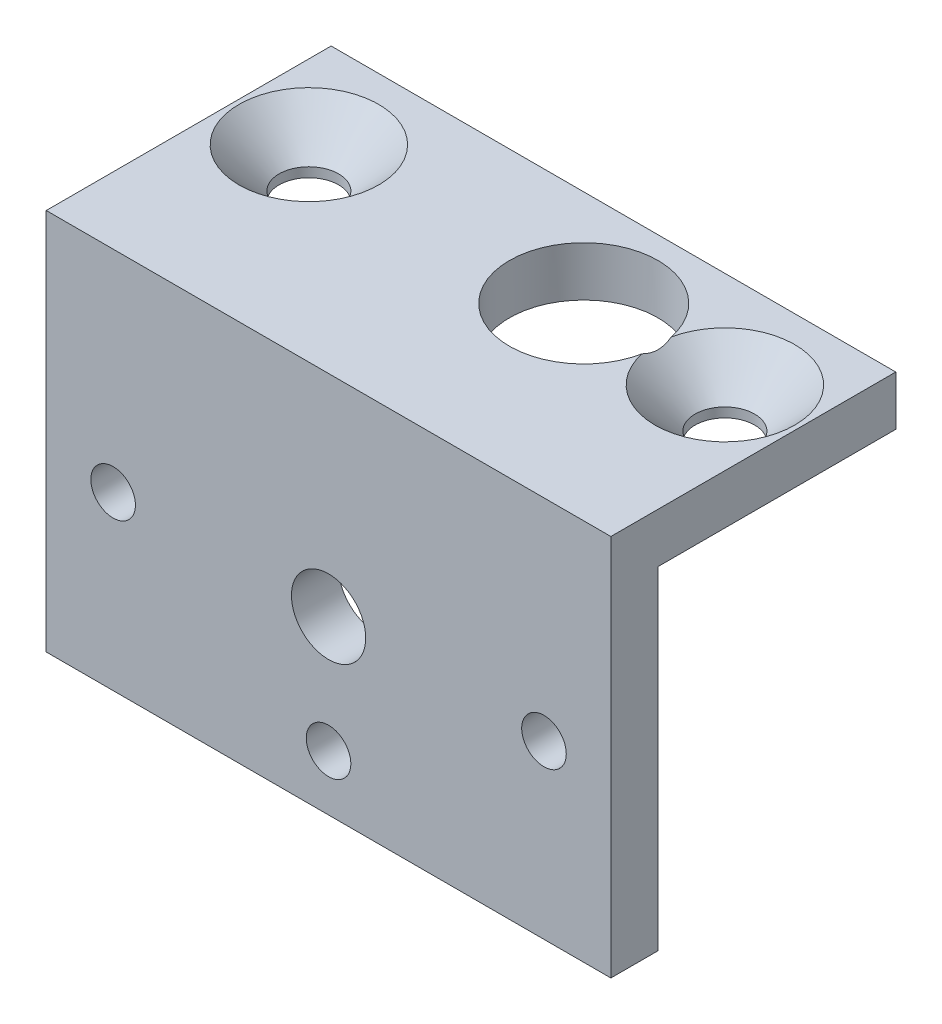
ISO-10303-21;
HEADER;
FILE_DESCRIPTION(('STEP AP214'),'2;1');
FILE_NAME('part.step','',(''),(''),'','','');
FILE_SCHEMA(('AUTOMOTIVE_DESIGN { 1 0 10303 214 1 1 1 1 }'));
ENDSEC;
DATA;
#1=APPLICATION_CONTEXT('core data for automotive mechanical design processes');
#2=APPLICATION_PROTOCOL_DEFINITION('international standard','automotive_design',2000,#1);
#3=PRODUCT_CONTEXT('',#1,'mechanical');
#4=PRODUCT('Part','Part','',(#3));
#5=PRODUCT_RELATED_PRODUCT_CATEGORY('part','',(#4));
#6=PRODUCT_DEFINITION_FORMATION('','',#4);
#7=PRODUCT_DEFINITION_CONTEXT('part definition',#1,'design');
#8=PRODUCT_DEFINITION('design','',#6,#7);
#9=PRODUCT_DEFINITION_SHAPE('','',#8);
#10=(LENGTH_UNIT() NAMED_UNIT(*) SI_UNIT(.MILLI.,.METRE.));
#11=(NAMED_UNIT(*) PLANE_ANGLE_UNIT() SI_UNIT($,.RADIAN.));
#12=(NAMED_UNIT(*) SI_UNIT($,.STERADIAN.) SOLID_ANGLE_UNIT());
#13=UNCERTAINTY_MEASURE_WITH_UNIT(LENGTH_MEASURE(1.E-05),#10,'distance_accuracy_value','');
#14=(GEOMETRIC_REPRESENTATION_CONTEXT(3) GLOBAL_UNCERTAINTY_ASSIGNED_CONTEXT((#13)) GLOBAL_UNIT_ASSIGNED_CONTEXT((#10,
#11,#12)) REPRESENTATION_CONTEXT('',''));
#15=CARTESIAN_POINT('',(0.,0.,0.));
#16=DIRECTION('',(0.,0.,1.));
#17=DIRECTION('',(1.,0.,0.));
#18=AXIS2_PLACEMENT_3D('',#15,#16,#17);
#19=CARTESIAN_POINT('',(19.0017833547208,-12.8676857975596,0.));
#20=DIRECTION('',(0.,0.,1.));
#21=DIRECTION('',(1.,0.,0.));
#22=AXIS2_PLACEMENT_3D('',#19,#20,#21);
#23=PLANE('',#22);
#24=CARTESIAN_POINT('',(0.,-9.13231420244036,0.));
#25=DIRECTION('',(0.,0.,1.));
#26=DIRECTION('',(1.,0.,0.));
#27=AXIS2_PLACEMENT_3D('',#24,#25,#26);
#28=CIRCLE('',#27,1.5);
#29=CARTESIAN_POINT('',(1.5,-9.13231420244036,0.));
#30=VERTEX_POINT('',#29);
#31=EDGE_CURVE('E139',#30,#30,#28,.T.);
#32=ORIENTED_EDGE('',*,*,#31,.T.);
#33=EDGE_LOOP('',(#32));
#34=FACE_BOUND('',#33,.T.);
#35=CARTESIAN_POINT('',(14.5,-1.30731420244036,0.));
#36=DIRECTION('',(0.,0.,1.));
#37=DIRECTION('',(1.,0.,0.));
#38=AXIS2_PLACEMENT_3D('',#35,#36,#37);
#39=CIRCLE('',#38,1.5);
#40=CARTESIAN_POINT('',(16.,-1.30731420244036,0.));
#41=VERTEX_POINT('',#40);
#42=EDGE_CURVE('E153',#41,#41,#39,.T.);
#43=ORIENTED_EDGE('',*,*,#42,.T.);
#44=EDGE_LOOP('',(#43));
#45=FACE_BOUND('',#44,.T.);
#46=CARTESIAN_POINT('',(-14.5,-1.30731420244036,0.));
#47=DIRECTION('',(0.,0.,1.));
#48=DIRECTION('',(1.,0.,0.));
#49=AXIS2_PLACEMENT_3D('',#46,#47,#48);
#50=CIRCLE('',#49,1.5);
#51=CARTESIAN_POINT('',(-13.,-1.30731420244036,0.));
#52=VERTEX_POINT('',#51);
#53=EDGE_CURVE('E159',#52,#52,#50,.T.);
#54=ORIENTED_EDGE('',*,*,#53,.T.);
#55=EDGE_LOOP('',(#54));
#56=FACE_BOUND('',#55,.T.);
#57=CARTESIAN_POINT('',(0.,-1.30731420244036,0.));
#58=DIRECTION('',(0.,0.,1.));
#59=DIRECTION('',(1.,0.,0.));
#60=AXIS2_PLACEMENT_3D('',#57,#58,#59);
#61=CIRCLE('',#60,2.5);
#62=CARTESIAN_POINT('',(2.5,-1.30731420244036,0.));
#63=VERTEX_POINT('',#62);
#64=EDGE_CURVE('E148',#63,#63,#61,.T.);
#65=ORIENTED_EDGE('',*,*,#64,.T.);
#66=EDGE_LOOP('',(#65));
#67=FACE_BOUND('',#66,.T.);
#68=DIRECTION('',(-1.,0.,0.));
#69=VECTOR('',#68,1.);
#70=CARTESIAN_POINT('',(-19.0017833547208,9.525,0.));
#71=LINE('',#70,#69);
#72=CARTESIAN_POINT('',(19.0017833547208,9.525,0.));
#73=VERTEX_POINT('',#72);
#74=CARTESIAN_POINT('',(-19.0017833547208,9.525,0.));
#75=VERTEX_POINT('',#74);
#76=EDGE_CURVE('E58',#73,#75,#71,.T.);
#77=ORIENTED_EDGE('',*,*,#76,.F.);
#78=DIRECTION('',(0.,1.,0.));
#79=VECTOR('',#78,1.);
#80=CARTESIAN_POINT('',(19.0017833547208,12.8676857975596,0.));
#81=LINE('',#80,#79);
#82=CARTESIAN_POINT('',(19.0017833547208,-12.8676857975596,0.));
#83=VERTEX_POINT('',#82);
#84=EDGE_CURVE('E165',#83,#73,#81,.T.);
#85=ORIENTED_EDGE('',*,*,#84,.F.);
#86=DIRECTION('',(1.,0.,0.));
#87=VECTOR('',#86,1.);
#88=CARTESIAN_POINT('',(-19.0017833547208,-12.8676857975596,0.));
#89=LINE('',#88,#87);
#90=CARTESIAN_POINT('',(-19.0017833547208,-12.8676857975596,0.));
#91=VERTEX_POINT('',#90);
#92=EDGE_CURVE('E172',#91,#83,#89,.T.);
#93=ORIENTED_EDGE('',*,*,#92,.F.);
#94=DIRECTION('',(0.,-1.,0.));
#95=VECTOR('',#94,1.);
#96=CARTESIAN_POINT('',(-19.0017833547208,12.8676857975596,0.));
#97=LINE('',#96,#95);
#98=EDGE_CURVE('E130',#75,#91,#97,.T.);
#99=ORIENTED_EDGE('',*,*,#98,.F.);
#100=EDGE_LOOP('',(#77,#85,#93,#99));
#101=FACE_BOUND('',#100,.T.);
#102=ADVANCED_FACE('F32',(#34,#45,#56,#67,#101),#23,.F.);
#103=CARTESIAN_POINT('',(19.0017833547208,-12.8676857975596,3.175));
#104=DIRECTION('',(0.,0.,1.));
#105=DIRECTION('',(1.,0.,0.));
#106=AXIS2_PLACEMENT_3D('',#103,#104,#105);
#107=PLANE('',#106);
#108=CARTESIAN_POINT('',(0.,-1.30731420244036,3.175));
#109=DIRECTION('',(0.,0.,1.));
#110=DIRECTION('',(1.,0.,0.));
#111=AXIS2_PLACEMENT_3D('',#108,#109,#110);
#112=CIRCLE('',#111,2.5);
#113=CARTESIAN_POINT('',(2.5,-1.30731420244036,3.175));
#114=VERTEX_POINT('',#113);
#115=EDGE_CURVE('E150',#114,#114,#112,.T.);
#116=ORIENTED_EDGE('',*,*,#115,.F.);
#117=EDGE_LOOP('',(#116));
#118=FACE_BOUND('',#117,.T.);
#119=CARTESIAN_POINT('',(-14.5,-1.30731420244036,3.175));
#120=DIRECTION('',(0.,0.,1.));
#121=DIRECTION('',(1.,0.,0.));
#122=AXIS2_PLACEMENT_3D('',#119,#120,#121);
#123=CIRCLE('',#122,1.5);
#124=CARTESIAN_POINT('',(-13.,-1.30731420244036,3.175));
#125=VERTEX_POINT('',#124);
#126=EDGE_CURVE('E162',#125,#125,#123,.T.);
#127=ORIENTED_EDGE('',*,*,#126,.F.);
#128=EDGE_LOOP('',(#127));
#129=FACE_BOUND('',#128,.T.);
#130=DIRECTION('',(0.,1.,0.));
#131=VECTOR('',#130,1.);
#132=CARTESIAN_POINT('',(19.0017833547208,12.8676857975596,3.175));
#133=LINE('',#132,#131);
#134=CARTESIAN_POINT('',(19.0017833547208,-12.8676857975596,3.175));
#135=VERTEX_POINT('',#134);
#136=CARTESIAN_POINT('',(19.0017833547208,12.8676857975596,3.175));
#137=VERTEX_POINT('',#136);
#138=EDGE_CURVE('E168',#135,#137,#133,.T.);
#139=ORIENTED_EDGE('',*,*,#138,.T.);
#140=DIRECTION('',(-1.,0.,0.));
#141=VECTOR('',#140,1.);
#142=CARTESIAN_POINT('',(-19.0017833547208,12.8676857975596,3.175));
#143=LINE('',#142,#141);
#144=CARTESIAN_POINT('',(-19.0017833547208,12.8676857975596,3.175));
#145=VERTEX_POINT('',#144);
#146=EDGE_CURVE('E171',#137,#145,#143,.T.);
#147=ORIENTED_EDGE('',*,*,#146,.T.);
#148=DIRECTION('',(0.,-1.,0.));
#149=VECTOR('',#148,1.);
#150=CARTESIAN_POINT('',(-19.0017833547208,12.8676857975596,3.175));
#151=LINE('',#150,#149);
#152=CARTESIAN_POINT('',(-19.0017833547208,-12.8676857975596,3.175));
#153=VERTEX_POINT('',#152);
#154=EDGE_CURVE('E174',#145,#153,#151,.T.);
#155=ORIENTED_EDGE('',*,*,#154,.T.);
#156=DIRECTION('',(1.,0.,0.));
#157=VECTOR('',#156,1.);
#158=CARTESIAN_POINT('',(-19.0017833547208,-12.8676857975596,3.175));
#159=LINE('',#158,#157);
#160=EDGE_CURVE('E176',#153,#135,#159,.T.);
#161=ORIENTED_EDGE('',*,*,#160,.T.);
#162=EDGE_LOOP('',(#139,#147,#155,#161));
#163=FACE_BOUND('',#162,.T.);
#164=CARTESIAN_POINT('',(14.5,-1.30731420244036,3.175));
#165=DIRECTION('',(0.,0.,1.));
#166=DIRECTION('',(1.,0.,0.));
#167=AXIS2_PLACEMENT_3D('',#164,#165,#166);
#168=CIRCLE('',#167,1.5);
#169=CARTESIAN_POINT('',(16.,-1.30731420244036,3.175));
#170=VERTEX_POINT('',#169);
#171=EDGE_CURVE('E156',#170,#170,#168,.T.);
#172=ORIENTED_EDGE('',*,*,#171,.F.);
#173=EDGE_LOOP('',(#172));
#174=FACE_BOUND('',#173,.T.);
#175=CARTESIAN_POINT('',(0.,-9.13231420244036,3.175));
#176=DIRECTION('',(0.,0.,1.));
#177=DIRECTION('',(1.,0.,0.));
#178=AXIS2_PLACEMENT_3D('',#175,#176,#177);
#179=CIRCLE('',#178,1.5);
#180=CARTESIAN_POINT('',(1.5,-9.13231420244036,3.175));
#181=VERTEX_POINT('',#180);
#182=EDGE_CURVE('E126',#181,#181,#179,.T.);
#183=ORIENTED_EDGE('',*,*,#182,.F.);
#184=EDGE_LOOP('',(#183));
#185=FACE_BOUND('',#184,.T.);
#186=ADVANCED_FACE('F206',(#118,#129,#163,#174,#185),#107,.T.);
#187=CARTESIAN_POINT('',(19.0017833547208,12.8676857975596,3.175));
#188=DIRECTION('',(-1.,0.,0.));
#189=DIRECTION('',(0.,0.,1.));
#190=AXIS2_PLACEMENT_3D('',#187,#188,#189);
#191=PLANE('',#190);
#192=ORIENTED_EDGE('',*,*,#84,.T.);
#193=DIRECTION('',(0.,0.,1.));
#194=VECTOR('',#193,1.);
#195=CARTESIAN_POINT('',(19.0017833547208,9.525,-16.));
#196=LINE('',#195,#194);
#197=CARTESIAN_POINT('',(19.0017833547208,9.525,-16.));
#198=VERTEX_POINT('',#197);
#199=EDGE_CURVE('E135',#198,#73,#196,.T.);
#200=ORIENTED_EDGE('',*,*,#199,.F.);
#201=DIRECTION('',(0.,-1.,0.));
#202=VECTOR('',#201,1.);
#203=CARTESIAN_POINT('',(19.0017833547208,12.8676857975596,-16.));
#204=LINE('',#203,#202);
#205=CARTESIAN_POINT('',(19.0017833547208,12.8676857975596,-16.));
#206=VERTEX_POINT('',#205);
#207=EDGE_CURVE('E119',#206,#198,#204,.T.);
#208=ORIENTED_EDGE('',*,*,#207,.F.);
#209=DIRECTION('',(0.,0.,-1.));
#210=VECTOR('',#209,1.);
#211=CARTESIAN_POINT('',(19.0017833547208,12.8676857975596,3.175));
#212=LINE('',#211,#210);
#213=EDGE_CURVE('E45',#137,#206,#212,.T.);
#214=ORIENTED_EDGE('',*,*,#213,.F.);
#215=ORIENTED_EDGE('',*,*,#138,.F.);
#216=DIRECTION('',(0.,0.,-1.));
#217=VECTOR('',#216,1.);
#218=CARTESIAN_POINT('',(19.0017833547208,-12.8676857975596,3.175));
#219=LINE('',#218,#217);
#220=EDGE_CURVE('E178',#135,#83,#219,.T.);
#221=ORIENTED_EDGE('',*,*,#220,.T.);
#222=EDGE_LOOP('',(#192,#200,#208,#214,#215,#221));
#223=FACE_BOUND('',#222,.T.);
#224=ADVANCED_FACE('F34',(#223),#191,.F.);
#225=CARTESIAN_POINT('',(-19.0017833547208,12.8676857975596,3.175));
#226=DIRECTION('',(0.,-1.,0.));
#227=DIRECTION('',(0.,0.,-1.));
#228=AXIS2_PLACEMENT_3D('',#225,#226,#227);
#229=PLANE('',#228);
#230=CARTESIAN_POINT('',(-14.,12.8676857975596,-9.5));
#231=DIRECTION('',(0.,1.,0.));
#232=DIRECTION('',(0.,0.,1.));
#233=AXIS2_PLACEMENT_3D('',#230,#231,#232);
#234=CIRCLE('',#233,4.7);
#235=CARTESIAN_POINT('',(-14.,12.8676857975596,-4.8));
#236=VERTEX_POINT('',#235);
#237=EDGE_CURVE('E248',#236,#236,#234,.T.);
#238=ORIENTED_EDGE('',*,*,#237,.F.);
#239=EDGE_LOOP('',(#238));
#240=FACE_BOUND('',#239,.T.);
#241=CARTESIAN_POINT('',(4.5,12.8676857975596,-9.5));
#242=DIRECTION('',(0.,-1.,0.));
#243=DIRECTION('',(0.,0.,-1.));
#244=AXIS2_PLACEMENT_3D('',#241,#242,#243);
#245=CIRCLE('',#244,5.);
#246=CARTESIAN_POINT('',(9.40315789473684,12.8676857975596,-8.52069276563492));
#247=VERTEX_POINT('',#246);
#248=CARTESIAN_POINT('',(9.40315789473685,12.8676857975596,-10.4793072343651));
#249=VERTEX_POINT('',#248);
#250=EDGE_CURVE('E100',#247,#249,#245,.T.);
#251=ORIENTED_EDGE('',*,*,#250,.T.);
#252=CARTESIAN_POINT('',(14.,12.8676857975596,-9.5));
#253=DIRECTION('',(0.,1.,0.));
#254=DIRECTION('',(0.,0.,1.));
#255=AXIS2_PLACEMENT_3D('',#252,#253,#254);
#256=CIRCLE('',#255,4.7);
#257=EDGE_CURVE('E51',#247,#249,#256,.T.);
#258=ORIENTED_EDGE('',*,*,#257,.F.);
#259=EDGE_LOOP('',(#251,#258));
#260=FACE_BOUND('',#259,.T.);
#261=ORIENTED_EDGE('',*,*,#213,.T.);
#262=DIRECTION('',(1.,0.,0.));
#263=VECTOR('',#262,1.);
#264=CARTESIAN_POINT('',(-19.0017833547208,12.8676857975596,-16.));
#265=LINE('',#264,#263);
#266=CARTESIAN_POINT('',(-19.0017833547208,12.8676857975596,-16.));
#267=VERTEX_POINT('',#266);
#268=EDGE_CURVE('E116',#267,#206,#265,.T.);
#269=ORIENTED_EDGE('',*,*,#268,.F.);
#270=DIRECTION('',(0.,0.,-1.));
#271=VECTOR('',#270,1.);
#272=CARTESIAN_POINT('',(-19.0017833547208,12.8676857975596,3.175));
#273=LINE('',#272,#271);
#274=EDGE_CURVE('E184',#145,#267,#273,.T.);
#275=ORIENTED_EDGE('',*,*,#274,.F.);
#276=ORIENTED_EDGE('',*,*,#146,.F.);
#277=EDGE_LOOP('',(#261,#269,#275,#276));
#278=FACE_BOUND('',#277,.T.);
#279=ADVANCED_FACE('F98',(#240,#260,#278),#229,.F.);
#280=CARTESIAN_POINT('',(-19.0017833547208,12.8676857975596,3.175));
#281=DIRECTION('',(1.,0.,0.));
#282=DIRECTION('',(0.,0.,-1.));
#283=AXIS2_PLACEMENT_3D('',#280,#281,#282);
#284=PLANE('',#283);
#285=ORIENTED_EDGE('',*,*,#274,.T.);
#286=DIRECTION('',(0.,1.,0.));
#287=VECTOR('',#286,1.);
#288=CARTESIAN_POINT('',(-19.0017833547208,12.8676857975596,-16.));
#289=LINE('',#288,#287);
#290=CARTESIAN_POINT('',(-19.0017833547208,9.525,-16.));
#291=VERTEX_POINT('',#290);
#292=EDGE_CURVE('E107',#291,#267,#289,.T.);
#293=ORIENTED_EDGE('',*,*,#292,.F.);
#294=DIRECTION('',(0.,0.,1.));
#295=VECTOR('',#294,1.);
#296=CARTESIAN_POINT('',(-19.0017833547208,9.525,-16.));
#297=LINE('',#296,#295);
#298=EDGE_CURVE('E123',#291,#75,#297,.T.);
#299=ORIENTED_EDGE('',*,*,#298,.T.);
#300=ORIENTED_EDGE('',*,*,#98,.T.);
#301=DIRECTION('',(0.,0.,-1.));
#302=VECTOR('',#301,1.);
#303=CARTESIAN_POINT('',(-19.0017833547208,-12.8676857975596,3.175));
#304=LINE('',#303,#302);
#305=EDGE_CURVE('E186',#153,#91,#304,.T.);
#306=ORIENTED_EDGE('',*,*,#305,.F.);
#307=ORIENTED_EDGE('',*,*,#154,.F.);
#308=EDGE_LOOP('',(#285,#293,#299,#300,#306,#307));
#309=FACE_BOUND('',#308,.T.);
#310=ADVANCED_FACE('F195',(#309),#284,.F.);
#311=CARTESIAN_POINT('',(-19.0017833547208,-12.8676857975596,3.175));
#312=DIRECTION('',(0.,1.,0.));
#313=DIRECTION('',(0.,0.,1.));
#314=AXIS2_PLACEMENT_3D('',#311,#312,#313);
#315=PLANE('',#314);
#316=ORIENTED_EDGE('',*,*,#92,.T.);
#317=ORIENTED_EDGE('',*,*,#220,.F.);
#318=ORIENTED_EDGE('',*,*,#160,.F.);
#319=ORIENTED_EDGE('',*,*,#305,.T.);
#320=EDGE_LOOP('',(#316,#317,#318,#319));
#321=FACE_BOUND('',#320,.T.);
#322=ADVANCED_FACE('F200',(#321),#315,.F.);
#323=CARTESIAN_POINT('',(-14.5,-1.30731420244036,3.175));
#324=DIRECTION('',(0.,0.,-1.));
#325=DIRECTION('',(-1.,0.,0.));
#326=AXIS2_PLACEMENT_3D('',#323,#324,#325);
#327=CYLINDRICAL_SURFACE('',#326,1.5);
#328=ORIENTED_EDGE('',*,*,#126,.T.);
#329=EDGE_LOOP('',(#328));
#330=FACE_BOUND('',#329,.T.);
#331=ORIENTED_EDGE('',*,*,#53,.F.);
#332=EDGE_LOOP('',(#331));
#333=FACE_BOUND('',#332,.T.);
#334=ADVANCED_FACE('F239',(#330,#333),#327,.F.);
#335=CARTESIAN_POINT('',(14.5,-1.30731420244036,3.175));
#336=DIRECTION('',(0.,0.,-1.));
#337=DIRECTION('',(-1.,0.,0.));
#338=AXIS2_PLACEMENT_3D('',#335,#336,#337);
#339=CYLINDRICAL_SURFACE('',#338,1.5);
#340=ORIENTED_EDGE('',*,*,#171,.T.);
#341=EDGE_LOOP('',(#340));
#342=FACE_BOUND('',#341,.T.);
#343=ORIENTED_EDGE('',*,*,#42,.F.);
#344=EDGE_LOOP('',(#343));
#345=FACE_BOUND('',#344,.T.);
#346=ADVANCED_FACE('F350',(#342,#345),#339,.F.);
#347=CARTESIAN_POINT('',(0.,-1.30731420244036,3.175));
#348=DIRECTION('',(0.,0.,-1.));
#349=DIRECTION('',(-1.,0.,0.));
#350=AXIS2_PLACEMENT_3D('',#347,#348,#349);
#351=CYLINDRICAL_SURFACE('',#350,2.5);
#352=ORIENTED_EDGE('',*,*,#115,.T.);
#353=EDGE_LOOP('',(#352));
#354=FACE_BOUND('',#353,.T.);
#355=ORIENTED_EDGE('',*,*,#64,.F.);
#356=EDGE_LOOP('',(#355));
#357=FACE_BOUND('',#356,.T.);
#358=ADVANCED_FACE('F222',(#354,#357),#351,.F.);
#359=CARTESIAN_POINT('',(0.,-9.13231420244036,3.175));
#360=DIRECTION('',(0.,0.,-1.));
#361=DIRECTION('',(-1.,0.,0.));
#362=AXIS2_PLACEMENT_3D('',#359,#360,#361);
#363=CYLINDRICAL_SURFACE('',#362,1.5);
#364=ORIENTED_EDGE('',*,*,#182,.T.);
#365=EDGE_LOOP('',(#364));
#366=FACE_BOUND('',#365,.T.);
#367=ORIENTED_EDGE('',*,*,#31,.F.);
#368=EDGE_LOOP('',(#367));
#369=FACE_BOUND('',#368,.T.);
#370=ADVANCED_FACE('F214',(#366,#369),#363,.F.);
#371=CARTESIAN_POINT('',(-19.0017833547208,9.525,-16.));
#372=DIRECTION('',(0.,1.,0.));
#373=DIRECTION('',(-1.,0.,0.));
#374=AXIS2_PLACEMENT_3D('',#371,#372,#373);
#375=PLANE('',#374);
#376=CARTESIAN_POINT('',(14.,9.525,-9.5));
#377=DIRECTION('',(0.,-1.,0.));
#378=DIRECTION('',(1.,0.,0.));
#379=AXIS2_PLACEMENT_3D('',#376,#377,#378);
#380=CIRCLE('',#379,2.00000000000001);
#381=CARTESIAN_POINT('',(16.,9.525,-9.5));
#382=VERTEX_POINT('',#381);
#383=EDGE_CURVE('E256',#382,#382,#380,.T.);
#384=ORIENTED_EDGE('',*,*,#383,.F.);
#385=EDGE_LOOP('',(#384));
#386=FACE_BOUND('',#385,.T.);
#387=CARTESIAN_POINT('',(-14.,9.525,-9.5));
#388=DIRECTION('',(0.,-1.,0.));
#389=DIRECTION('',(1.,0.,0.));
#390=AXIS2_PLACEMENT_3D('',#387,#388,#389);
#391=CIRCLE('',#390,2.);
#392=CARTESIAN_POINT('',(-12.,9.525,-9.5));
#393=VERTEX_POINT('',#392);
#394=EDGE_CURVE('E110',#393,#393,#391,.T.);
#395=ORIENTED_EDGE('',*,*,#394,.F.);
#396=EDGE_LOOP('',(#395));
#397=FACE_BOUND('',#396,.T.);
#398=CARTESIAN_POINT('',(4.5,9.525,-9.5));
#399=DIRECTION('',(0.,-1.,0.));
#400=DIRECTION('',(1.,0.,0.));
#401=AXIS2_PLACEMENT_3D('',#398,#399,#400);
#402=CIRCLE('',#401,5.);
#403=CARTESIAN_POINT('',(9.5,9.525,-9.5));
#404=VERTEX_POINT('',#403);
#405=EDGE_CURVE('E105',#404,#404,#402,.T.);
#406=ORIENTED_EDGE('',*,*,#405,.F.);
#407=EDGE_LOOP('',(#406));
#408=FACE_BOUND('',#407,.T.);
#409=ORIENTED_EDGE('',*,*,#76,.T.);
#410=ORIENTED_EDGE('',*,*,#298,.F.);
#411=DIRECTION('',(-1.,0.,0.));
#412=VECTOR('',#411,1.);
#413=CARTESIAN_POINT('',(-19.0017833547208,9.525,-16.));
#414=LINE('',#413,#412);
#415=EDGE_CURVE('E121',#198,#291,#414,.T.);
#416=ORIENTED_EDGE('',*,*,#415,.F.);
#417=ORIENTED_EDGE('',*,*,#199,.T.);
#418=EDGE_LOOP('',(#409,#410,#416,#417));
#419=FACE_BOUND('',#418,.T.);
#420=ADVANCED_FACE('F212',(#386,#397,#408,#419),#375,.F.);
#421=CARTESIAN_POINT('',(-19.0017833547208,9.525,-16.));
#422=DIRECTION('',(0.,0.,1.));
#423=DIRECTION('',(1.,0.,0.));
#424=AXIS2_PLACEMENT_3D('',#421,#422,#423);
#425=PLANE('',#424);
#426=ORIENTED_EDGE('',*,*,#292,.T.);
#427=ORIENTED_EDGE('',*,*,#268,.T.);
#428=ORIENTED_EDGE('',*,*,#207,.T.);
#429=ORIENTED_EDGE('',*,*,#415,.T.);
#430=EDGE_LOOP('',(#426,#427,#428,#429));
#431=FACE_BOUND('',#430,.T.);
#432=ADVANCED_FACE('F211',(#431),#425,.F.);
#433=CARTESIAN_POINT('',(4.5,19.525,-9.5));
#434=DIRECTION('',(0.,-1.,0.));
#435=DIRECTION('',(1.,0.,0.));
#436=AXIS2_PLACEMENT_3D('',#433,#434,#435);
#437=CYLINDRICAL_SURFACE('',#436,5.);
#438=ORIENTED_EDGE('',*,*,#405,.T.);
#439=EDGE_LOOP('',(#438));
#440=FACE_BOUND('',#439,.T.);
#441=ORIENTED_EDGE('',*,*,#250,.F.);
#442=CARTESIAN_POINT('',(9.40305894526308,12.8678857975598,-8.5201974794502));
#443=CARTESIAN_POINT('',(9.414985292583,12.8437797885901,-8.57985973431514));
#444=CARTESIAN_POINT('',(9.42595805830429,12.821416477412,-8.64045481610169));
#445=CARTESIAN_POINT('',(9.44583329714527,12.7806658876555,-8.76338246555672));
#446=CARTESIAN_POINT('',(9.45473307195989,12.7622837933799,-8.82571718080232));
#447=CARTESIAN_POINT('',(9.47024576790227,12.7300962697811,-8.95166470226807));
#448=CARTESIAN_POINT('',(9.47686499121341,12.7162782323729,-9.01527346383401));
#449=CARTESIAN_POINT('',(9.48769312705081,12.6936066557661,-9.14354789340066));
#450=CARTESIAN_POINT('',(9.49190316228801,12.6847508041687,-9.20821305463187));
#451=CARTESIAN_POINT('',(9.49782644530809,12.6722766782467,-9.33868371296744));
#452=CARTESIAN_POINT('',(9.49951989648036,12.6686999332885,-9.40449417378513));
#453=CARTESIAN_POINT('',(9.500304282738,12.6670428311325,-9.53620660694409));
#454=CARTESIAN_POINT('',(9.49939417050929,12.6689646858114,-9.60210860545003));
#455=CARTESIAN_POINT('',(9.49276805419871,12.6829416489739,-9.79900969946282));
#456=CARTESIAN_POINT('',(9.48316551127663,12.7031886900967,-9.92940953000257));
#457=CARTESIAN_POINT('',(9.46076193872665,12.7498011610678,-10.1294817617755));
#458=CARTESIAN_POINT('',(9.45111243952822,12.7697906277757,-10.2011530174432));
#459=CARTESIAN_POINT('',(9.42907221651022,12.8150665225785,-10.3422041315284));
#460=CARTESIAN_POINT('',(9.41668750764748,12.840341321398,-10.4115886397668));
#461=CARTESIAN_POINT('',(9.40305894526316,12.8678857975596,-10.4798025205494));
#462=B_SPLINE_CURVE_WITH_KNOTS('',3,(#442,#443,#444,#445,#446,#447,#448,#449,#450,#451,#452,
#453,#454,#455,#456,#457,#458,#459,#460,#461),.UNSPECIFIED.,.F.,.F.,(4,2,2,2,2,2,2,2,2,4),(0.,
0.196347658365351,0.392949481654247,0.589003564594833,0.784966209389369,0.982462373957265,
1.18003799485539,1.57457830643797,1.79944317893501,2.02381839306053),.UNSPECIFIED.);
#463=EDGE_CURVE('E11',#247,#249,#462,.T.);
#464=ORIENTED_EDGE('',*,*,#463,.T.);
#465=EDGE_LOOP('',(#441,#464));
#466=FACE_BOUND('',#465,.T.);
#467=ADVANCED_FACE('F104',(#440,#466),#437,.F.);
#468=CARTESIAN_POINT('',(-14.,19.525,-9.5));
#469=DIRECTION('',(0.,-1.,0.));
#470=DIRECTION('',(1.,0.,0.));
#471=AXIS2_PLACEMENT_3D('',#468,#469,#470);
#472=CYLINDRICAL_SURFACE('',#471,2.);
#473=CARTESIAN_POINT('',(-14.,10.1676857975596,-9.5));
#474=DIRECTION('',(0.,1.,0.));
#475=DIRECTION('',(0.,0.,1.));
#476=AXIS2_PLACEMENT_3D('',#473,#474,#475);
#477=CIRCLE('',#476,1.99999999999999);
#478=CARTESIAN_POINT('',(-14.,10.1676857975596,-7.50000000000002));
#479=VERTEX_POINT('',#478);
#480=EDGE_CURVE('E102',#479,#479,#477,.T.);
#481=ORIENTED_EDGE('',*,*,#480,.T.);
#482=EDGE_LOOP('',(#481));
#483=FACE_BOUND('',#482,.T.);
#484=ORIENTED_EDGE('',*,*,#394,.T.);
#485=EDGE_LOOP('',(#484));
#486=FACE_BOUND('',#485,.T.);
#487=ADVANCED_FACE('F261',(#483,#486),#472,.F.);
#488=CARTESIAN_POINT('',(14.,19.525,-9.5));
#489=DIRECTION('',(0.,-1.,0.));
#490=DIRECTION('',(1.,0.,0.));
#491=AXIS2_PLACEMENT_3D('',#488,#489,#490);
#492=CYLINDRICAL_SURFACE('',#491,2.00000000000001);
#493=CARTESIAN_POINT('',(14.,10.1676857975596,-9.5));
#494=DIRECTION('',(0.,1.,0.));
#495=DIRECTION('',(0.,0.,1.));
#496=AXIS2_PLACEMENT_3D('',#493,#494,#495);
#497=CIRCLE('',#496,1.99999999999999);
#498=CARTESIAN_POINT('',(14.,10.1676857975596,-7.50000000000001));
#499=VERTEX_POINT('',#498);
#500=EDGE_CURVE('E101',#499,#499,#497,.T.);
#501=ORIENTED_EDGE('',*,*,#500,.T.);
#502=EDGE_LOOP('',(#501));
#503=FACE_BOUND('',#502,.T.);
#504=ORIENTED_EDGE('',*,*,#383,.T.);
#505=EDGE_LOOP('',(#504));
#506=FACE_BOUND('',#505,.T.);
#507=ADVANCED_FACE('F269',(#503,#506),#492,.F.);
#508=CARTESIAN_POINT('',(14.,12.8676857975596,-9.5));
#509=DIRECTION('',(0.,1.,0.));
#510=DIRECTION('',(0.,0.,1.));
#511=AXIS2_PLACEMENT_3D('',#508,#509,#510);
#512=CONICAL_SURFACE('',#511,4.7,0.785398163397449);
#513=ORIENTED_EDGE('',*,*,#500,.F.);
#514=EDGE_LOOP('',(#513));
#515=FACE_BOUND('',#514,.T.);
#516=ORIENTED_EDGE('',*,*,#257,.T.);
#517=ORIENTED_EDGE('',*,*,#463,.F.);
#518=EDGE_LOOP('',(#516,#517));
#519=FACE_BOUND('',#518,.T.);
#520=ADVANCED_FACE('F93',(#515,#519),#512,.F.);
#521=CARTESIAN_POINT('',(-14.,12.8676857975596,-9.5));
#522=DIRECTION('',(0.,1.,0.));
#523=DIRECTION('',(0.,0.,1.));
#524=AXIS2_PLACEMENT_3D('',#521,#522,#523);
#525=CONICAL_SURFACE('',#524,4.7,0.785398163397449);
#526=ORIENTED_EDGE('',*,*,#480,.F.);
#527=EDGE_LOOP('',(#526));
#528=FACE_BOUND('',#527,.T.);
#529=ORIENTED_EDGE('',*,*,#237,.T.);
#530=EDGE_LOOP('',(#529));
#531=FACE_BOUND('',#530,.T.);
#532=ADVANCED_FACE('F279',(#528,#531),#525,.F.);
#533=CLOSED_SHELL('',(#102,#186,#224,#279,#310,#322,#334,#346,#358,#370,#420,#432,#467,#487,
#507,#520,#532));
#534=MANIFOLD_SOLID_BREP('B2',#533);
#535=ADVANCED_BREP_SHAPE_REPRESENTATION('',(#18,#534),#14);
#536=SHAPE_DEFINITION_REPRESENTATION(#9,#535);
ENDSEC;
END-ISO-10303-21;
